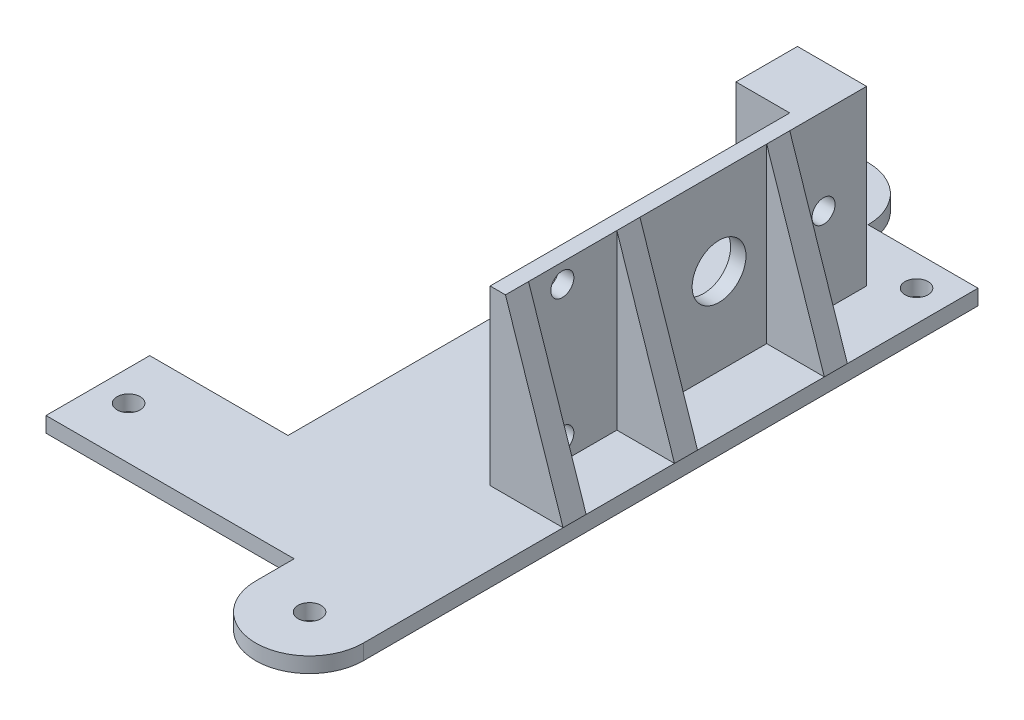
ISO-10303-21;
HEADER;
FILE_DESCRIPTION(('STEP AP214'),'2;1');
FILE_NAME('part.step','',(''),(''),'','','');
FILE_SCHEMA(('AUTOMOTIVE_DESIGN { 1 0 10303 214 1 1 1 1 }'));
ENDSEC;
DATA;
#1=APPLICATION_CONTEXT('core data for automotive mechanical design processes');
#2=APPLICATION_PROTOCOL_DEFINITION('international standard','automotive_design',2000,#1);
#3=PRODUCT_CONTEXT('',#1,'mechanical');
#4=PRODUCT('Part','Part','',(#3));
#5=PRODUCT_RELATED_PRODUCT_CATEGORY('part','',(#4));
#6=PRODUCT_DEFINITION_FORMATION('','',#4);
#7=PRODUCT_DEFINITION_CONTEXT('part definition',#1,'design');
#8=PRODUCT_DEFINITION('design','',#6,#7);
#9=PRODUCT_DEFINITION_SHAPE('','',#8);
#10=(LENGTH_UNIT() NAMED_UNIT(*) SI_UNIT(.MILLI.,.METRE.));
#11=(NAMED_UNIT(*) PLANE_ANGLE_UNIT() SI_UNIT($,.RADIAN.));
#12=(NAMED_UNIT(*) SI_UNIT($,.STERADIAN.) SOLID_ANGLE_UNIT());
#13=UNCERTAINTY_MEASURE_WITH_UNIT(LENGTH_MEASURE(1.E-05),#10,'distance_accuracy_value','');
#14=(GEOMETRIC_REPRESENTATION_CONTEXT(3) GLOBAL_UNCERTAINTY_ASSIGNED_CONTEXT((#13)) GLOBAL_UNIT_ASSIGNED_CONTEXT((#10,
#11,#12)) REPRESENTATION_CONTEXT('',''));
#15=CARTESIAN_POINT('',(0.,0.,0.));
#16=DIRECTION('',(0.,0.,1.));
#17=DIRECTION('',(1.,0.,0.));
#18=AXIS2_PLACEMENT_3D('',#15,#16,#17);
#19=CARTESIAN_POINT('',(-7.5,24.5,54.));
#20=DIRECTION('',(-1.,0.,0.));
#21=DIRECTION('',(0.,0.,1.));
#22=AXIS2_PLACEMENT_3D('',#19,#20,#21);
#23=PLANE('',#22);
#24=CARTESIAN_POINT('',(-7.5,13.25,12.6));
#25=DIRECTION('',(1.,0.,0.));
#26=DIRECTION('',(0.,0.,-1.));
#27=AXIS2_PLACEMENT_3D('',#24,#25,#26);
#28=CIRCLE('',#27,1.5);
#29=CARTESIAN_POINT('',(-7.5,13.25,11.1));
#30=VERTEX_POINT('',#29);
#31=EDGE_CURVE('E336',#30,#30,#28,.T.);
#32=ORIENTED_EDGE('',*,*,#31,.F.);
#33=EDGE_LOOP('',(#32));
#34=FACE_BOUND('',#33,.T.);
#35=DIRECTION('',(0.,1.,0.));
#36=VECTOR('',#35,1.);
#37=CARTESIAN_POINT('',(-7.5,24.5,17.));
#38=LINE('',#37,#36);
#39=CARTESIAN_POINT('',(-7.5,2.,17.));
#40=VERTEX_POINT('',#39);
#41=CARTESIAN_POINT('',(-7.5,24.5,17.));
#42=VERTEX_POINT('',#41);
#43=EDGE_CURVE('E215',#40,#42,#38,.T.);
#44=ORIENTED_EDGE('',*,*,#43,.F.);
#45=DIRECTION('',(0.,0.,-1.));
#46=VECTOR('',#45,1.);
#47=CARTESIAN_POINT('',(-7.5,2.,54.));
#48=LINE('',#47,#46);
#49=CARTESIAN_POINT('',(-7.5,2.,7.));
#50=VERTEX_POINT('',#49);
#51=EDGE_CURVE('E392',#40,#50,#48,.T.);
#52=ORIENTED_EDGE('',*,*,#51,.T.);
#53=DIRECTION('',(0.,-1.,0.));
#54=VECTOR('',#53,1.);
#55=CARTESIAN_POINT('',(-7.5,24.5,7.));
#56=LINE('',#55,#54);
#57=CARTESIAN_POINT('',(-7.5,24.5,7.));
#58=VERTEX_POINT('',#57);
#59=EDGE_CURVE('E378',#58,#50,#56,.T.);
#60=ORIENTED_EDGE('',*,*,#59,.F.);
#61=DIRECTION('',(0.,0.,-1.));
#62=VECTOR('',#61,1.);
#63=CARTESIAN_POINT('',(-7.5,24.5,54.));
#64=LINE('',#63,#62);
#65=EDGE_CURVE('E374',#42,#58,#64,.T.);
#66=ORIENTED_EDGE('',*,*,#65,.F.);
#67=EDGE_LOOP('',(#44,#52,#60,#66));
#68=FACE_BOUND('',#67,.T.);
#69=ADVANCED_FACE('F33',(#34,#68),#23,.F.);
#70=CARTESIAN_POINT('',(-7.,2.,80.));
#71=DIRECTION('',(0.,-1.,0.));
#72=DIRECTION('',(0.,0.,-1.));
#73=AXIS2_PLACEMENT_3D('',#70,#71,#72);
#74=PLANE('',#73);
#75=DIRECTION('',(0.,0.,-1.));
#76=VECTOR('',#75,1.);
#77=CARTESIAN_POINT('',(0.,2.,80.));
#78=LINE('',#77,#76);
#79=CARTESIAN_POINT('',(0.,2.,36.5));
#80=VERTEX_POINT('',#79);
#81=CARTESIAN_POINT('',(0.,2.,20.));
#82=VERTEX_POINT('',#81);
#83=EDGE_CURVE('E212',#80,#82,#78,.T.);
#84=ORIENTED_EDGE('',*,*,#83,.T.);
#85=DIRECTION('',(1.,0.,0.));
#86=VECTOR('',#85,1.);
#87=CARTESIAN_POINT('',(-23.15,2.,20.));
#88=LINE('',#87,#86);
#89=CARTESIAN_POINT('',(-7.5,2.,20.));
#90=VERTEX_POINT('',#89);
#91=EDGE_CURVE('E189',#90,#82,#88,.T.);
#92=ORIENTED_EDGE('',*,*,#91,.F.);
#93=CARTESIAN_POINT('',(-7.5,2.,36.5));
#94=VERTEX_POINT('',#93);
#95=EDGE_CURVE('E395',#94,#90,#48,.T.);
#96=ORIENTED_EDGE('',*,*,#95,.F.);
#97=DIRECTION('',(1.,0.,0.));
#98=VECTOR('',#97,1.);
#99=CARTESIAN_POINT('',(-23.15,2.,36.5));
#100=LINE('',#99,#98);
#101=EDGE_CURVE('E219',#94,#80,#100,.T.);
#102=ORIENTED_EDGE('',*,*,#101,.T.);
#103=EDGE_LOOP('',(#84,#92,#96,#102));
#104=FACE_BOUND('',#103,.T.);
#105=ADVANCED_FACE('F218',(#104),#74,.F.);
#106=CARTESIAN_POINT('',(-7.5,13.25,26.2));
#107=DIRECTION('',(1.,0.,0.));
#108=DIRECTION('',(0.,0.,-1.));
#109=AXIS2_PLACEMENT_3D('',#106,#107,#108);
#110=CIRCLE('',#109,3.5);
#111=CARTESIAN_POINT('',(-7.5,13.25,22.7));
#112=VERTEX_POINT('',#111);
#113=EDGE_CURVE('E344',#112,#112,#110,.T.);
#114=ORIENTED_EDGE('',*,*,#113,.F.);
#115=EDGE_LOOP('',(#114));
#116=FACE_BOUND('',#115,.T.);
#117=ORIENTED_EDGE('',*,*,#95,.T.);
#118=DIRECTION('',(0.,1.,0.));
#119=VECTOR('',#118,1.);
#120=CARTESIAN_POINT('',(-7.5,24.5,20.));
#121=LINE('',#120,#119);
#122=CARTESIAN_POINT('',(-7.5,24.5,20.));
#123=VERTEX_POINT('',#122);
#124=EDGE_CURVE('E194',#90,#123,#121,.T.);
#125=ORIENTED_EDGE('',*,*,#124,.T.);
#126=CARTESIAN_POINT('',(-7.5,24.5,36.5));
#127=VERTEX_POINT('',#126);
#128=EDGE_CURVE('E475',#127,#123,#64,.T.);
#129=ORIENTED_EDGE('',*,*,#128,.F.);
#130=DIRECTION('',(0.,1.,0.));
#131=VECTOR('',#130,1.);
#132=CARTESIAN_POINT('',(-7.5,24.5,36.5));
#133=LINE('',#132,#131);
#134=EDGE_CURVE('E318',#94,#127,#133,.T.);
#135=ORIENTED_EDGE('',*,*,#134,.F.);
#136=EDGE_LOOP('',(#117,#125,#129,#135));
#137=FACE_BOUND('',#136,.T.);
#138=ADVANCED_FACE('F473',(#116,#137),#23,.F.);
#139=CARTESIAN_POINT('',(0.,2.,51.));
#140=VERTEX_POINT('',#139);
#141=CARTESIAN_POINT('',(0.,2.,39.5));
#142=VERTEX_POINT('',#141);
#143=EDGE_CURVE('E220',#140,#142,#78,.T.);
#144=ORIENTED_EDGE('',*,*,#143,.T.);
#145=DIRECTION('',(1.,0.,0.));
#146=VECTOR('',#145,1.);
#147=CARTESIAN_POINT('',(-23.15,2.,39.5));
#148=LINE('',#147,#146);
#149=CARTESIAN_POINT('',(-7.5,2.,39.5));
#150=VERTEX_POINT('',#149);
#151=EDGE_CURVE('E312',#150,#142,#148,.T.);
#152=ORIENTED_EDGE('',*,*,#151,.F.);
#153=CARTESIAN_POINT('',(-7.5,2.,51.));
#154=VERTEX_POINT('',#153);
#155=EDGE_CURVE('E365',#154,#150,#48,.T.);
#156=ORIENTED_EDGE('',*,*,#155,.F.);
#157=DIRECTION('',(1.,0.,0.));
#158=VECTOR('',#157,1.);
#159=CARTESIAN_POINT('',(-23.15,2.,51.));
#160=LINE('',#159,#158);
#161=EDGE_CURVE('E327',#154,#140,#160,.T.);
#162=ORIENTED_EDGE('',*,*,#161,.T.);
#163=EDGE_LOOP('',(#144,#152,#156,#162));
#164=FACE_BOUND('',#163,.T.);
#165=ADVANCED_FACE('F437',(#164),#74,.F.);
#166=CARTESIAN_POINT('',(-7.5,4.5,46.6));
#167=DIRECTION('',(1.,0.,0.));
#168=DIRECTION('',(0.,0.,-1.));
#169=AXIS2_PLACEMENT_3D('',#166,#167,#168);
#170=CIRCLE('',#169,1.5);
#171=CARTESIAN_POINT('',(-7.5,4.5,45.1));
#172=VERTEX_POINT('',#171);
#173=EDGE_CURVE('E341',#172,#172,#170,.T.);
#174=ORIENTED_EDGE('',*,*,#173,.F.);
#175=EDGE_LOOP('',(#174));
#176=FACE_BOUND('',#175,.T.);
#177=CARTESIAN_POINT('',(-7.5,22.,46.6));
#178=DIRECTION('',(1.,0.,0.));
#179=DIRECTION('',(0.,0.,-1.));
#180=AXIS2_PLACEMENT_3D('',#177,#178,#179);
#181=CIRCLE('',#180,1.5);
#182=CARTESIAN_POINT('',(-7.5,22.,45.1));
#183=VERTEX_POINT('',#182);
#184=EDGE_CURVE('E337',#183,#183,#181,.T.);
#185=ORIENTED_EDGE('',*,*,#184,.F.);
#186=EDGE_LOOP('',(#185));
#187=FACE_BOUND('',#186,.T.);
#188=ORIENTED_EDGE('',*,*,#155,.T.);
#189=DIRECTION('',(0.,1.,0.));
#190=VECTOR('',#189,1.);
#191=CARTESIAN_POINT('',(-7.5,24.5,39.5));
#192=LINE('',#191,#190);
#193=CARTESIAN_POINT('',(-7.5,24.5,39.5));
#194=VERTEX_POINT('',#193);
#195=EDGE_CURVE('E320',#150,#194,#192,.T.);
#196=ORIENTED_EDGE('',*,*,#195,.T.);
#197=CARTESIAN_POINT('',(-7.5,24.5,51.));
#198=VERTEX_POINT('',#197);
#199=EDGE_CURVE('E379',#198,#194,#64,.T.);
#200=ORIENTED_EDGE('',*,*,#199,.F.);
#201=DIRECTION('',(0.,1.,0.));
#202=VECTOR('',#201,1.);
#203=CARTESIAN_POINT('',(-7.5,24.5,51.));
#204=LINE('',#203,#202);
#205=EDGE_CURVE('E333',#154,#198,#204,.T.);
#206=ORIENTED_EDGE('',*,*,#205,.F.);
#207=EDGE_LOOP('',(#188,#196,#200,#206));
#208=FACE_BOUND('',#207,.T.);
#209=ADVANCED_FACE('F440',(#176,#187,#208),#23,.F.);
#210=CARTESIAN_POINT('',(-4.,2.,4.));
#211=DIRECTION('',(0.,1.,0.));
#212=DIRECTION('',(0.,0.,1.));
#213=AXIS2_PLACEMENT_3D('',#210,#211,#212);
#214=CIRCLE('',#213,1.5);
#215=CARTESIAN_POINT('',(-4.,2.,5.5));
#216=VERTEX_POINT('',#215);
#217=EDGE_CURVE('E293',#216,#216,#214,.T.);
#218=ORIENTED_EDGE('',*,*,#217,.F.);
#219=EDGE_LOOP('',(#218));
#220=FACE_BOUND('',#219,.T.);
#221=CARTESIAN_POINT('',(-42.3,2.,68.25));
#222=DIRECTION('',(0.,1.,0.));
#223=DIRECTION('',(0.,0.,1.));
#224=AXIS2_PLACEMENT_3D('',#221,#222,#223);
#225=CIRCLE('',#224,1.5);
#226=CARTESIAN_POINT('',(-42.3,2.,69.75));
#227=VERTEX_POINT('',#226);
#228=EDGE_CURVE('E282',#227,#227,#225,.T.);
#229=ORIENTED_EDGE('',*,*,#228,.F.);
#230=EDGE_LOOP('',(#229));
#231=FACE_BOUND('',#230,.T.);
#232=CARTESIAN_POINT('',(-7.,2.,80.));
#233=DIRECTION('',(0.,1.,0.));
#234=DIRECTION('',(0.,0.,1.));
#235=AXIS2_PLACEMENT_3D('',#232,#233,#234);
#236=CIRCLE('',#235,1.5);
#237=CARTESIAN_POINT('',(-7.,2.,81.5));
#238=VERTEX_POINT('',#237);
#239=EDGE_CURVE('E281',#238,#238,#236,.T.);
#240=ORIENTED_EDGE('',*,*,#239,.F.);
#241=EDGE_LOOP('',(#240));
#242=FACE_BOUND('',#241,.T.);
#243=CARTESIAN_POINT('',(-21.3,2.,0.));
#244=DIRECTION('',(0.,1.,0.));
#245=DIRECTION('',(0.,0.,1.));
#246=AXIS2_PLACEMENT_3D('',#243,#244,#245);
#247=CIRCLE('',#246,1.5);
#248=CARTESIAN_POINT('',(-21.3,2.,1.49999999999995));
#249=VERTEX_POINT('',#248);
#250=EDGE_CURVE('E297',#249,#249,#247,.T.);
#251=ORIENTED_EDGE('',*,*,#250,.F.);
#252=EDGE_LOOP('',(#251));
#253=FACE_BOUND('',#252,.T.);
#254=DIRECTION('',(1.,0.,0.));
#255=VECTOR('',#254,1.);
#256=CARTESIAN_POINT('',(-9.49999999999999,2.,54.));
#257=LINE('',#256,#255);
#258=CARTESIAN_POINT('',(-9.49999999999999,2.,54.));
#259=VERTEX_POINT('',#258);
#260=CARTESIAN_POINT('',(0.,2.,54.));
#261=VERTEX_POINT('',#260);
#262=EDGE_CURVE('E390',#259,#261,#257,.T.);
#263=ORIENTED_EDGE('',*,*,#262,.F.);
#264=DIRECTION('',(0.,0.,1.));
#265=VECTOR('',#264,1.);
#266=CARTESIAN_POINT('',(-9.5,2.,15.));
#267=LINE('',#266,#265);
#268=CARTESIAN_POINT('',(-9.5,2.,15.));
#269=VERTEX_POINT('',#268);
#270=EDGE_CURVE('E388',#269,#259,#267,.T.);
#271=ORIENTED_EDGE('',*,*,#270,.F.);
#272=DIRECTION('',(1.,0.,0.));
#273=VECTOR('',#272,1.);
#274=CARTESIAN_POINT('',(-16.5,2.,15.));
#275=LINE('',#274,#273);
#276=CARTESIAN_POINT('',(-16.5,2.,15.));
#277=VERTEX_POINT('',#276);
#278=EDGE_CURVE('E385',#277,#269,#275,.T.);
#279=ORIENTED_EDGE('',*,*,#278,.F.);
#280=DIRECTION('',(0.,0.,1.));
#281=VECTOR('',#280,1.);
#282=CARTESIAN_POINT('',(-16.5,2.,7.));
#283=LINE('',#282,#281);
#284=CARTESIAN_POINT('',(-16.5,2.,7.00000000000001));
#285=VERTEX_POINT('',#284);
#286=EDGE_CURVE('E382',#285,#277,#283,.T.);
#287=ORIENTED_EDGE('',*,*,#286,.F.);
#288=DIRECTION('',(-1.,0.,0.));
#289=VECTOR('',#288,1.);
#290=CARTESIAN_POINT('',(-7.5,2.,7.));
#291=LINE('',#290,#289);
#292=EDGE_CURVE('E360',#50,#285,#291,.T.);
#293=ORIENTED_EDGE('',*,*,#292,.F.);
#294=ORIENTED_EDGE('',*,*,#51,.F.);
#295=DIRECTION('',(1.,0.,0.));
#296=VECTOR('',#295,1.);
#297=CARTESIAN_POINT('',(-7.5,2.,17.));
#298=LINE('',#297,#296);
#299=CARTESIAN_POINT('',(0.,2.,17.));
#300=VERTEX_POINT('',#299);
#301=EDGE_CURVE('E205',#40,#300,#298,.T.);
#302=ORIENTED_EDGE('',*,*,#301,.T.);
#303=CARTESIAN_POINT('',(0.,2.,0.));
#304=VERTEX_POINT('',#303);
#305=EDGE_CURVE('E214',#300,#304,#78,.T.);
#306=ORIENTED_EDGE('',*,*,#305,.T.);
#307=DIRECTION('',(-1.,0.,0.));
#308=VECTOR('',#307,1.);
#309=CARTESIAN_POINT('',(0.,2.,0.));
#310=LINE('',#309,#308);
#311=CARTESIAN_POINT('',(-14.3,2.,0.));
#312=VERTEX_POINT('',#311);
#313=EDGE_CURVE('E228',#304,#312,#310,.T.);
#314=ORIENTED_EDGE('',*,*,#313,.T.);
#315=CARTESIAN_POINT('',(-21.3,2.,0.));
#316=DIRECTION('',(0.,1.,0.));
#317=DIRECTION('',(0.,0.,-1.));
#318=AXIS2_PLACEMENT_3D('',#315,#316,#317);
#319=CIRCLE('',#318,7.);
#320=CARTESIAN_POINT('',(-28.3,2.,0.));
#321=VERTEX_POINT('',#320);
#322=EDGE_CURVE('E231',#312,#321,#319,.T.);
#323=ORIENTED_EDGE('',*,*,#322,.T.);
#324=DIRECTION('',(0.,0.,1.));
#325=VECTOR('',#324,1.);
#326=CARTESIAN_POINT('',(-28.3,2.,61.5));
#327=LINE('',#326,#325);
#328=CARTESIAN_POINT('',(-28.3,2.,61.5));
#329=VERTEX_POINT('',#328);
#330=EDGE_CURVE('E233',#321,#329,#327,.T.);
#331=ORIENTED_EDGE('',*,*,#330,.T.);
#332=DIRECTION('',(-1.,0.,0.));
#333=VECTOR('',#332,1.);
#334=CARTESIAN_POINT('',(-28.3,2.,61.5));
#335=LINE('',#334,#333);
#336=CARTESIAN_POINT('',(-46.3,2.,61.5));
#337=VERTEX_POINT('',#336);
#338=EDGE_CURVE('E257',#329,#337,#335,.T.);
#339=ORIENTED_EDGE('',*,*,#338,.T.);
#340=DIRECTION('',(0.,0.,1.));
#341=VECTOR('',#340,1.);
#342=CARTESIAN_POINT('',(-46.3,2.,61.5));
#343=LINE('',#342,#341);
#344=CARTESIAN_POINT('',(-46.3,2.,75.));
#345=VERTEX_POINT('',#344);
#346=EDGE_CURVE('E411',#337,#345,#343,.T.);
#347=ORIENTED_EDGE('',*,*,#346,.T.);
#348=DIRECTION('',(1.,0.,0.));
#349=VECTOR('',#348,1.);
#350=CARTESIAN_POINT('',(-46.3,2.,75.));
#351=LINE('',#350,#349);
#352=CARTESIAN_POINT('',(-14.,2.,75.));
#353=VERTEX_POINT('',#352);
#354=EDGE_CURVE('E413',#345,#353,#351,.T.);
#355=ORIENTED_EDGE('',*,*,#354,.T.);
#356=DIRECTION('',(0.,0.,1.));
#357=VECTOR('',#356,1.);
#358=CARTESIAN_POINT('',(-14.,2.,80.));
#359=LINE('',#358,#357);
#360=CARTESIAN_POINT('',(-14.,2.,80.));
#361=VERTEX_POINT('',#360);
#362=EDGE_CURVE('E414',#353,#361,#359,.T.);
#363=ORIENTED_EDGE('',*,*,#362,.T.);
#364=CARTESIAN_POINT('',(-7.,2.,80.));
#365=DIRECTION('',(0.,1.,0.));
#366=DIRECTION('',(0.,0.,-1.));
#367=AXIS2_PLACEMENT_3D('',#364,#365,#366);
#368=CIRCLE('',#367,7.);
#369=CARTESIAN_POINT('',(0.,2.,80.));
#370=VERTEX_POINT('',#369);
#371=EDGE_CURVE('E224',#361,#370,#368,.T.);
#372=ORIENTED_EDGE('',*,*,#371,.T.);
#373=EDGE_CURVE('E223',#370,#261,#78,.T.);
#374=ORIENTED_EDGE('',*,*,#373,.T.);
#375=EDGE_LOOP('',(#263,#271,#279,#287,#293,#294,#302,#306,#314,#323,#331,#339,#347,#355,#363,
#372,#374));
#376=FACE_BOUND('',#375,.T.);
#377=ADVANCED_FACE('F421',(#220,#231,#242,#253,#376),#74,.F.);
#378=CARTESIAN_POINT('',(-28.3,2.,61.5));
#379=DIRECTION('',(0.,0.,1.));
#380=DIRECTION('',(1.,0.,0.));
#381=AXIS2_PLACEMENT_3D('',#378,#379,#380);
#382=PLANE('',#381);
#383=DIRECTION('',(-1.,0.,0.));
#384=VECTOR('',#383,1.);
#385=CARTESIAN_POINT('',(-28.3,0.,61.5));
#386=LINE('',#385,#384);
#387=CARTESIAN_POINT('',(-28.3,0.,61.5));
#388=VERTEX_POINT('',#387);
#389=CARTESIAN_POINT('',(-46.3,0.,61.5));
#390=VERTEX_POINT('',#389);
#391=EDGE_CURVE('E236',#388,#390,#386,.T.);
#392=ORIENTED_EDGE('',*,*,#391,.T.);
#393=DIRECTION('',(0.,-1.,0.));
#394=VECTOR('',#393,1.);
#395=CARTESIAN_POINT('',(-46.3,2.,61.5));
#396=LINE('',#395,#394);
#397=EDGE_CURVE('E11',#337,#390,#396,.T.);
#398=ORIENTED_EDGE('',*,*,#397,.F.);
#399=ORIENTED_EDGE('',*,*,#338,.F.);
#400=DIRECTION('',(0.,-1.,0.));
#401=VECTOR('',#400,1.);
#402=CARTESIAN_POINT('',(-28.3,2.,61.5));
#403=LINE('',#402,#401);
#404=EDGE_CURVE('E235',#329,#388,#403,.T.);
#405=ORIENTED_EDGE('',*,*,#404,.T.);
#406=EDGE_LOOP('',(#392,#398,#399,#405));
#407=FACE_BOUND('',#406,.T.);
#408=ADVANCED_FACE('F35',(#407),#382,.F.);
#409=CARTESIAN_POINT('',(-46.3,2.,61.5));
#410=DIRECTION('',(1.,0.,0.));
#411=DIRECTION('',(0.,0.,-1.));
#412=AXIS2_PLACEMENT_3D('',#409,#410,#411);
#413=PLANE('',#412);
#414=DIRECTION('',(0.,0.,1.));
#415=VECTOR('',#414,1.);
#416=CARTESIAN_POINT('',(-46.3,0.,61.5));
#417=LINE('',#416,#415);
#418=CARTESIAN_POINT('',(-46.3,0.,75.));
#419=VERTEX_POINT('',#418);
#420=EDGE_CURVE('E239',#390,#419,#417,.T.);
#421=ORIENTED_EDGE('',*,*,#420,.T.);
#422=DIRECTION('',(0.,-1.,0.));
#423=VECTOR('',#422,1.);
#424=CARTESIAN_POINT('',(-46.3,2.,75.));
#425=LINE('',#424,#423);
#426=EDGE_CURVE('E42',#345,#419,#425,.T.);
#427=ORIENTED_EDGE('',*,*,#426,.F.);
#428=ORIENTED_EDGE('',*,*,#346,.F.);
#429=ORIENTED_EDGE('',*,*,#397,.T.);
#430=EDGE_LOOP('',(#421,#427,#428,#429));
#431=FACE_BOUND('',#430,.T.);
#432=ADVANCED_FACE('F578',(#431),#413,.F.);
#433=CARTESIAN_POINT('',(-46.3,2.,75.));
#434=DIRECTION('',(0.,0.,-1.));
#435=DIRECTION('',(-1.,0.,0.));
#436=AXIS2_PLACEMENT_3D('',#433,#434,#435);
#437=PLANE('',#436);
#438=DIRECTION('',(1.,0.,0.));
#439=VECTOR('',#438,1.);
#440=CARTESIAN_POINT('',(-46.3,0.,75.));
#441=LINE('',#440,#439);
#442=CARTESIAN_POINT('',(-14.,0.,75.));
#443=VERTEX_POINT('',#442);
#444=EDGE_CURVE('E242',#419,#443,#441,.T.);
#445=ORIENTED_EDGE('',*,*,#444,.T.);
#446=DIRECTION('',(0.,-1.,0.));
#447=VECTOR('',#446,1.);
#448=CARTESIAN_POINT('',(-14.,2.,75.));
#449=LINE('',#448,#447);
#450=EDGE_CURVE('E275',#353,#443,#449,.T.);
#451=ORIENTED_EDGE('',*,*,#450,.F.);
#452=ORIENTED_EDGE('',*,*,#354,.F.);
#453=ORIENTED_EDGE('',*,*,#426,.T.);
#454=EDGE_LOOP('',(#445,#451,#452,#453));
#455=FACE_BOUND('',#454,.T.);
#456=ADVANCED_FACE('F575',(#455),#437,.F.);
#457=CARTESIAN_POINT('',(-14.,2.,80.));
#458=DIRECTION('',(1.,0.,0.));
#459=DIRECTION('',(0.,0.,-1.));
#460=AXIS2_PLACEMENT_3D('',#457,#458,#459);
#461=PLANE('',#460);
#462=DIRECTION('',(0.,0.,1.));
#463=VECTOR('',#462,1.);
#464=CARTESIAN_POINT('',(-14.,0.,80.));
#465=LINE('',#464,#463);
#466=CARTESIAN_POINT('',(-14.,0.,80.));
#467=VERTEX_POINT('',#466);
#468=EDGE_CURVE('E244',#443,#467,#465,.T.);
#469=ORIENTED_EDGE('',*,*,#468,.T.);
#470=DIRECTION('',(0.,-1.,0.));
#471=VECTOR('',#470,1.);
#472=CARTESIAN_POINT('',(-14.,2.,80.));
#473=LINE('',#472,#471);
#474=EDGE_CURVE('E272',#361,#467,#473,.T.);
#475=ORIENTED_EDGE('',*,*,#474,.F.);
#476=ORIENTED_EDGE('',*,*,#362,.F.);
#477=ORIENTED_EDGE('',*,*,#450,.T.);
#478=EDGE_LOOP('',(#469,#475,#476,#477));
#479=FACE_BOUND('',#478,.T.);
#480=ADVANCED_FACE('F572',(#479),#461,.F.);
#481=CARTESIAN_POINT('',(-7.,2.,80.));
#482=DIRECTION('',(0.,-1.,0.));
#483=DIRECTION('',(0.,0.,-1.));
#484=AXIS2_PLACEMENT_3D('',#481,#482,#483);
#485=CYLINDRICAL_SURFACE('',#484,7.);
#486=CARTESIAN_POINT('',(-7.,0.,80.));
#487=DIRECTION('',(0.,1.,0.));
#488=DIRECTION('',(0.,0.,1.));
#489=AXIS2_PLACEMENT_3D('',#486,#487,#488);
#490=CIRCLE('',#489,7.);
#491=CARTESIAN_POINT('',(0.,0.,80.));
#492=VERTEX_POINT('',#491);
#493=EDGE_CURVE('E247',#467,#492,#490,.T.);
#494=ORIENTED_EDGE('',*,*,#493,.T.);
#495=DIRECTION('',(0.,-1.,0.));
#496=VECTOR('',#495,1.);
#497=CARTESIAN_POINT('',(0.,2.,80.));
#498=LINE('',#497,#496);
#499=EDGE_CURVE('E269',#370,#492,#498,.T.);
#500=ORIENTED_EDGE('',*,*,#499,.F.);
#501=ORIENTED_EDGE('',*,*,#371,.F.);
#502=ORIENTED_EDGE('',*,*,#474,.T.);
#503=EDGE_LOOP('',(#494,#500,#501,#502));
#504=FACE_BOUND('',#503,.T.);
#505=ADVANCED_FACE('F424',(#504),#485,.T.);
#506=CARTESIAN_POINT('',(0.,2.,80.));
#507=DIRECTION('',(-1.,0.,0.));
#508=DIRECTION('',(0.,0.,1.));
#509=AXIS2_PLACEMENT_3D('',#506,#507,#508);
#510=PLANE('',#509);
#511=DIRECTION('',(0.,0.,-1.));
#512=VECTOR('',#511,1.);
#513=CARTESIAN_POINT('',(0.,0.,80.));
#514=LINE('',#513,#512);
#515=CARTESIAN_POINT('',(0.,0.,0.));
#516=VERTEX_POINT('',#515);
#517=EDGE_CURVE('E249',#492,#516,#514,.T.);
#518=ORIENTED_EDGE('',*,*,#517,.T.);
#519=DIRECTION('',(0.,-1.,0.));
#520=VECTOR('',#519,1.);
#521=CARTESIAN_POINT('',(0.,2.,0.));
#522=LINE('',#521,#520);
#523=EDGE_CURVE('E266',#304,#516,#522,.T.);
#524=ORIENTED_EDGE('',*,*,#523,.F.);
#525=ORIENTED_EDGE('',*,*,#305,.F.);
#526=DIRECTION('',(0.,0.,1.));
#527=VECTOR('',#526,1.);
#528=CARTESIAN_POINT('',(0.,2.,17.));
#529=LINE('',#528,#527);
#530=EDGE_CURVE('E199',#300,#82,#529,.T.);
#531=ORIENTED_EDGE('',*,*,#530,.T.);
#532=ORIENTED_EDGE('',*,*,#83,.F.);
#533=DIRECTION('',(0.,0.,1.));
#534=VECTOR('',#533,1.);
#535=CARTESIAN_POINT('',(0.,2.,38.));
#536=LINE('',#535,#534);
#537=EDGE_CURVE('E314',#80,#142,#536,.T.);
#538=ORIENTED_EDGE('',*,*,#537,.T.);
#539=ORIENTED_EDGE('',*,*,#143,.F.);
#540=DIRECTION('',(0.,0.,1.));
#541=VECTOR('',#540,1.);
#542=CARTESIAN_POINT('',(0.,2.,54.));
#543=LINE('',#542,#541);
#544=EDGE_CURVE('E326',#140,#261,#543,.T.);
#545=ORIENTED_EDGE('',*,*,#544,.T.);
#546=ORIENTED_EDGE('',*,*,#373,.F.);
#547=ORIENTED_EDGE('',*,*,#499,.T.);
#548=EDGE_LOOP('',(#518,#524,#525,#531,#532,#538,#539,#545,#546,#547));
#549=FACE_BOUND('',#548,.T.);
#550=ADVANCED_FACE('F210',(#549),#510,.F.);
#551=CARTESIAN_POINT('',(0.,2.,0.));
#552=DIRECTION('',(0.,0.,1.));
#553=DIRECTION('',(1.,0.,0.));
#554=AXIS2_PLACEMENT_3D('',#551,#552,#553);
#555=PLANE('',#554);
#556=DIRECTION('',(-1.,0.,0.));
#557=VECTOR('',#556,1.);
#558=CARTESIAN_POINT('',(0.,0.,0.));
#559=LINE('',#558,#557);
#560=CARTESIAN_POINT('',(-14.3,0.,0.));
#561=VERTEX_POINT('',#560);
#562=EDGE_CURVE('E251',#516,#561,#559,.T.);
#563=ORIENTED_EDGE('',*,*,#562,.T.);
#564=DIRECTION('',(0.,-1.,0.));
#565=VECTOR('',#564,1.);
#566=CARTESIAN_POINT('',(-14.3,2.,0.));
#567=LINE('',#566,#565);
#568=EDGE_CURVE('E263',#312,#561,#567,.T.);
#569=ORIENTED_EDGE('',*,*,#568,.F.);
#570=ORIENTED_EDGE('',*,*,#313,.F.);
#571=ORIENTED_EDGE('',*,*,#523,.T.);
#572=EDGE_LOOP('',(#563,#569,#570,#571));
#573=FACE_BOUND('',#572,.T.);
#574=ADVANCED_FACE('F563',(#573),#555,.F.);
#575=CARTESIAN_POINT('',(-21.3,2.,0.));
#576=DIRECTION('',(0.,-1.,0.));
#577=DIRECTION('',(0.,0.,-1.));
#578=AXIS2_PLACEMENT_3D('',#575,#576,#577);
#579=CYLINDRICAL_SURFACE('',#578,7.);
#580=CARTESIAN_POINT('',(-21.3,0.,0.));
#581=DIRECTION('',(0.,1.,0.));
#582=DIRECTION('',(0.,0.,-1.));
#583=AXIS2_PLACEMENT_3D('',#580,#581,#582);
#584=CIRCLE('',#583,7.);
#585=CARTESIAN_POINT('',(-28.3,0.,0.));
#586=VERTEX_POINT('',#585);
#587=EDGE_CURVE('E253',#561,#586,#584,.T.);
#588=ORIENTED_EDGE('',*,*,#587,.T.);
#589=DIRECTION('',(0.,-1.,0.));
#590=VECTOR('',#589,1.);
#591=CARTESIAN_POINT('',(-28.3,2.,0.));
#592=LINE('',#591,#590);
#593=EDGE_CURVE('E260',#321,#586,#592,.T.);
#594=ORIENTED_EDGE('',*,*,#593,.F.);
#595=ORIENTED_EDGE('',*,*,#322,.F.);
#596=ORIENTED_EDGE('',*,*,#568,.T.);
#597=EDGE_LOOP('',(#588,#594,#595,#596));
#598=FACE_BOUND('',#597,.T.);
#599=ADVANCED_FACE('F559',(#598),#579,.T.);
#600=CARTESIAN_POINT('',(-28.3,2.,61.5));
#601=DIRECTION('',(1.,0.,0.));
#602=DIRECTION('',(0.,0.,-1.));
#603=AXIS2_PLACEMENT_3D('',#600,#601,#602);
#604=PLANE('',#603);
#605=DIRECTION('',(0.,0.,1.));
#606=VECTOR('',#605,1.);
#607=CARTESIAN_POINT('',(-28.3,0.,61.5));
#608=LINE('',#607,#606);
#609=EDGE_CURVE('E255',#586,#388,#608,.T.);
#610=ORIENTED_EDGE('',*,*,#609,.T.);
#611=ORIENTED_EDGE('',*,*,#404,.F.);
#612=ORIENTED_EDGE('',*,*,#330,.F.);
#613=ORIENTED_EDGE('',*,*,#593,.T.);
#614=EDGE_LOOP('',(#610,#611,#612,#613));
#615=FACE_BOUND('',#614,.T.);
#616=ADVANCED_FACE('F555',(#615),#604,.F.);
#617=CARTESIAN_POINT('',(-7.,0.,80.));
#618=DIRECTION('',(0.,-1.,0.));
#619=DIRECTION('',(0.,0.,-1.));
#620=AXIS2_PLACEMENT_3D('',#617,#618,#619);
#621=PLANE('',#620);
#622=CARTESIAN_POINT('',(-4.,0.,4.));
#623=DIRECTION('',(0.,-1.,0.));
#624=DIRECTION('',(0.,0.,-1.));
#625=AXIS2_PLACEMENT_3D('',#622,#623,#624);
#626=CIRCLE('',#625,1.5);
#627=CARTESIAN_POINT('',(-4.,0.,2.5));
#628=VERTEX_POINT('',#627);
#629=EDGE_CURVE('E37',#628,#628,#626,.T.);
#630=ORIENTED_EDGE('',*,*,#629,.F.);
#631=EDGE_LOOP('',(#630));
#632=FACE_BOUND('',#631,.T.);
#633=CARTESIAN_POINT('',(-42.3,0.,68.25));
#634=DIRECTION('',(0.,-1.,0.));
#635=DIRECTION('',(0.,0.,-1.));
#636=AXIS2_PLACEMENT_3D('',#633,#634,#635);
#637=CIRCLE('',#636,1.5);
#638=CARTESIAN_POINT('',(-42.3,0.,66.75));
#639=VERTEX_POINT('',#638);
#640=EDGE_CURVE('E279',#639,#639,#637,.T.);
#641=ORIENTED_EDGE('',*,*,#640,.F.);
#642=EDGE_LOOP('',(#641));
#643=FACE_BOUND('',#642,.T.);
#644=CARTESIAN_POINT('',(-7.,0.,80.));
#645=DIRECTION('',(0.,1.,0.));
#646=DIRECTION('',(0.,0.,1.));
#647=AXIS2_PLACEMENT_3D('',#644,#645,#646);
#648=CIRCLE('',#647,1.5);
#649=CARTESIAN_POINT('',(-7.,0.,81.5));
#650=VERTEX_POINT('',#649);
#651=EDGE_CURVE('E286',#650,#650,#648,.T.);
#652=ORIENTED_EDGE('',*,*,#651,.T.);
#653=EDGE_LOOP('',(#652));
#654=FACE_BOUND('',#653,.T.);
#655=CARTESIAN_POINT('',(-21.3,0.,0.));
#656=DIRECTION('',(0.,1.,0.));
#657=DIRECTION('',(0.,0.,1.));
#658=AXIS2_PLACEMENT_3D('',#655,#656,#657);
#659=CIRCLE('',#658,1.5);
#660=CARTESIAN_POINT('',(-21.3,0.,1.49999999999995));
#661=VERTEX_POINT('',#660);
#662=EDGE_CURVE('E299',#661,#661,#659,.T.);
#663=ORIENTED_EDGE('',*,*,#662,.T.);
#664=EDGE_LOOP('',(#663));
#665=FACE_BOUND('',#664,.T.);
#666=ORIENTED_EDGE('',*,*,#391,.F.);
#667=ORIENTED_EDGE('',*,*,#609,.F.);
#668=ORIENTED_EDGE('',*,*,#587,.F.);
#669=ORIENTED_EDGE('',*,*,#562,.F.);
#670=ORIENTED_EDGE('',*,*,#517,.F.);
#671=ORIENTED_EDGE('',*,*,#493,.F.);
#672=ORIENTED_EDGE('',*,*,#468,.F.);
#673=ORIENTED_EDGE('',*,*,#444,.F.);
#674=ORIENTED_EDGE('',*,*,#420,.F.);
#675=EDGE_LOOP('',(#666,#667,#668,#669,#670,#671,#672,#673,#674));
#676=FACE_BOUND('',#675,.T.);
#677=ADVANCED_FACE('F551',(#632,#643,#654,#665,#676),#621,.T.);
#678=CARTESIAN_POINT('',(-7.5,24.5,7.));
#679=DIRECTION('',(0.,0.,1.));
#680=DIRECTION('',(1.,0.,0.));
#681=AXIS2_PLACEMENT_3D('',#678,#679,#680);
#682=PLANE('',#681);
#683=ORIENTED_EDGE('',*,*,#292,.T.);
#684=DIRECTION('',(0.,-1.,0.));
#685=VECTOR('',#684,1.);
#686=CARTESIAN_POINT('',(-16.5,24.5,7.));
#687=LINE('',#686,#685);
#688=CARTESIAN_POINT('',(-16.5,24.5,7.));
#689=VERTEX_POINT('',#688);
#690=EDGE_CURVE('E240',#689,#285,#687,.T.);
#691=ORIENTED_EDGE('',*,*,#690,.F.);
#692=DIRECTION('',(-1.,0.,0.));
#693=VECTOR('',#692,1.);
#694=CARTESIAN_POINT('',(-7.5,24.5,7.));
#695=LINE('',#694,#693);
#696=EDGE_CURVE('E361',#58,#689,#695,.T.);
#697=ORIENTED_EDGE('',*,*,#696,.F.);
#698=ORIENTED_EDGE('',*,*,#59,.T.);
#699=EDGE_LOOP('',(#683,#691,#697,#698));
#700=FACE_BOUND('',#699,.T.);
#701=ADVANCED_FACE('F467',(#700),#682,.F.);
#702=CARTESIAN_POINT('',(-16.5,24.5,7.));
#703=DIRECTION('',(1.,0.,0.));
#704=DIRECTION('',(0.,0.,-1.));
#705=AXIS2_PLACEMENT_3D('',#702,#703,#704);
#706=PLANE('',#705);
#707=CARTESIAN_POINT('',(-16.5,13.25,12.6));
#708=DIRECTION('',(1.,0.,0.));
#709=DIRECTION('',(0.,0.,-1.));
#710=AXIS2_PLACEMENT_3D('',#707,#708,#709);
#711=CIRCLE('',#710,1.5);
#712=CARTESIAN_POINT('',(-16.5,13.25,11.1));
#713=VERTEX_POINT('',#712);
#714=EDGE_CURVE('E340',#713,#713,#711,.T.);
#715=ORIENTED_EDGE('',*,*,#714,.T.);
#716=EDGE_LOOP('',(#715));
#717=FACE_BOUND('',#716,.T.);
#718=ORIENTED_EDGE('',*,*,#286,.T.);
#719=DIRECTION('',(0.,-1.,0.));
#720=VECTOR('',#719,1.);
#721=CARTESIAN_POINT('',(-16.5,24.5,15.));
#722=LINE('',#721,#720);
#723=CARTESIAN_POINT('',(-16.5,24.5,15.));
#724=VERTEX_POINT('',#723);
#725=EDGE_CURVE('E404',#724,#277,#722,.T.);
#726=ORIENTED_EDGE('',*,*,#725,.F.);
#727=DIRECTION('',(0.,0.,1.));
#728=VECTOR('',#727,1.);
#729=CARTESIAN_POINT('',(-16.5,24.5,7.));
#730=LINE('',#729,#728);
#731=EDGE_CURVE('E364',#689,#724,#730,.T.);
#732=ORIENTED_EDGE('',*,*,#731,.F.);
#733=ORIENTED_EDGE('',*,*,#690,.T.);
#734=EDGE_LOOP('',(#718,#726,#732,#733));
#735=FACE_BOUND('',#734,.T.);
#736=ADVANCED_FACE('F462',(#717,#735),#706,.F.);
#737=CARTESIAN_POINT('',(-16.5,24.5,15.));
#738=DIRECTION('',(0.,0.,-1.));
#739=DIRECTION('',(-1.,0.,0.));
#740=AXIS2_PLACEMENT_3D('',#737,#738,#739);
#741=PLANE('',#740);
#742=ORIENTED_EDGE('',*,*,#278,.T.);
#743=DIRECTION('',(0.,-1.,0.));
#744=VECTOR('',#743,1.);
#745=CARTESIAN_POINT('',(-9.5,24.5,15.));
#746=LINE('',#745,#744);
#747=CARTESIAN_POINT('',(-9.5,24.5,15.));
#748=VERTEX_POINT('',#747);
#749=EDGE_CURVE('E401',#748,#269,#746,.T.);
#750=ORIENTED_EDGE('',*,*,#749,.F.);
#751=DIRECTION('',(1.,0.,0.));
#752=VECTOR('',#751,1.);
#753=CARTESIAN_POINT('',(-16.5,24.5,15.));
#754=LINE('',#753,#752);
#755=EDGE_CURVE('E367',#724,#748,#754,.T.);
#756=ORIENTED_EDGE('',*,*,#755,.F.);
#757=ORIENTED_EDGE('',*,*,#725,.T.);
#758=EDGE_LOOP('',(#742,#750,#756,#757));
#759=FACE_BOUND('',#758,.T.);
#760=ADVANCED_FACE('F453',(#759),#741,.F.);
#761=CARTESIAN_POINT('',(-9.5,24.5,15.));
#762=DIRECTION('',(1.,0.,0.));
#763=DIRECTION('',(0.,0.,-1.));
#764=AXIS2_PLACEMENT_3D('',#761,#762,#763);
#765=PLANE('',#764);
#766=DIRECTION('',(0.,-1.,0.));
#767=VECTOR('',#766,1.);
#768=CARTESIAN_POINT('',(-9.49999999999999,24.5,54.));
#769=LINE('',#768,#767);
#770=CARTESIAN_POINT('',(-9.49999999999999,24.5,54.));
#771=VERTEX_POINT('',#770);
#772=EDGE_CURVE('E398',#771,#259,#769,.T.);
#773=ORIENTED_EDGE('',*,*,#772,.F.);
#774=DIRECTION('',(0.,0.,1.));
#775=VECTOR('',#774,1.);
#776=CARTESIAN_POINT('',(-9.5,24.5,15.));
#777=LINE('',#776,#775);
#778=EDGE_CURVE('E369',#748,#771,#777,.T.);
#779=ORIENTED_EDGE('',*,*,#778,.F.);
#780=ORIENTED_EDGE('',*,*,#749,.T.);
#781=ORIENTED_EDGE('',*,*,#270,.T.);
#782=EDGE_LOOP('',(#773,#779,#780,#781));
#783=FACE_BOUND('',#782,.T.);
#784=CARTESIAN_POINT('',(-9.49999999999999,4.5,46.6));
#785=DIRECTION('',(1.,0.,0.));
#786=DIRECTION('',(0.,0.,-1.));
#787=AXIS2_PLACEMENT_3D('',#784,#785,#786);
#788=CIRCLE('',#787,1.5);
#789=CARTESIAN_POINT('',(-9.49999999999999,4.5,45.1));
#790=VERTEX_POINT('',#789);
#791=EDGE_CURVE('E354',#790,#790,#788,.T.);
#792=ORIENTED_EDGE('',*,*,#791,.T.);
#793=EDGE_LOOP('',(#792));
#794=FACE_BOUND('',#793,.T.);
#795=CARTESIAN_POINT('',(-9.49999999999999,22.,46.6));
#796=DIRECTION('',(1.,0.,0.));
#797=DIRECTION('',(0.,0.,-1.));
#798=AXIS2_PLACEMENT_3D('',#795,#796,#797);
#799=CIRCLE('',#798,1.5);
#800=CARTESIAN_POINT('',(-9.49999999999999,22.,45.1));
#801=VERTEX_POINT('',#800);
#802=EDGE_CURVE('E357',#801,#801,#799,.T.);
#803=ORIENTED_EDGE('',*,*,#802,.T.);
#804=EDGE_LOOP('',(#803));
#805=FACE_BOUND('',#804,.T.);
#806=CARTESIAN_POINT('',(-9.49999999999999,13.25,26.2));
#807=DIRECTION('',(1.,0.,0.));
#808=DIRECTION('',(0.,0.,-1.));
#809=AXIS2_PLACEMENT_3D('',#806,#807,#808);
#810=CIRCLE('',#809,3.5);
#811=CARTESIAN_POINT('',(-9.49999999999999,13.25,22.7));
#812=VERTEX_POINT('',#811);
#813=EDGE_CURVE('E351',#812,#812,#810,.T.);
#814=ORIENTED_EDGE('',*,*,#813,.T.);
#815=EDGE_LOOP('',(#814));
#816=FACE_BOUND('',#815,.T.);
#817=ADVANCED_FACE('F457',(#783,#794,#805,#816),#765,.F.);
#818=CARTESIAN_POINT('',(-9.49999999999999,24.5,54.));
#819=DIRECTION('',(0.,0.,-1.));
#820=DIRECTION('',(-1.,0.,0.));
#821=AXIS2_PLACEMENT_3D('',#818,#819,#820);
#822=PLANE('',#821);
#823=ORIENTED_EDGE('',*,*,#262,.T.);
#824=DIRECTION('',(-0.316227766016838,0.948683298050514,0.));
#825=VECTOR('',#824,1.);
#826=CARTESIAN_POINT('',(0.,2.,54.));
#827=LINE('',#826,#825);
#828=CARTESIAN_POINT('',(-7.5,24.5,54.));
#829=VERTEX_POINT('',#828);
#830=EDGE_CURVE('E323',#261,#829,#827,.T.);
#831=ORIENTED_EDGE('',*,*,#830,.T.);
#832=DIRECTION('',(1.,0.,0.));
#833=VECTOR('',#832,1.);
#834=CARTESIAN_POINT('',(-9.49999999999999,24.5,54.));
#835=LINE('',#834,#833);
#836=EDGE_CURVE('E371',#771,#829,#835,.T.);
#837=ORIENTED_EDGE('',*,*,#836,.F.);
#838=ORIENTED_EDGE('',*,*,#772,.T.);
#839=EDGE_LOOP('',(#823,#831,#837,#838));
#840=FACE_BOUND('',#839,.T.);
#841=ADVANCED_FACE('F448',(#840),#822,.F.);
#842=CARTESIAN_POINT('',(0.,24.5,0.));
#843=DIRECTION('',(0.,1.,0.));
#844=DIRECTION('',(0.,0.,1.));
#845=AXIS2_PLACEMENT_3D('',#842,#843,#844);
#846=PLANE('',#845);
#847=ORIENTED_EDGE('',*,*,#128,.T.);
#848=EDGE_CURVE('E204',#123,#42,#64,.T.);
#849=ORIENTED_EDGE('',*,*,#848,.T.);
#850=ORIENTED_EDGE('',*,*,#65,.T.);
#851=ORIENTED_EDGE('',*,*,#696,.T.);
#852=ORIENTED_EDGE('',*,*,#731,.T.);
#853=ORIENTED_EDGE('',*,*,#755,.T.);
#854=ORIENTED_EDGE('',*,*,#778,.T.);
#855=ORIENTED_EDGE('',*,*,#836,.T.);
#856=EDGE_CURVE('E375',#829,#198,#64,.T.);
#857=ORIENTED_EDGE('',*,*,#856,.T.);
#858=ORIENTED_EDGE('',*,*,#199,.T.);
#859=EDGE_CURVE('E444',#194,#127,#64,.T.);
#860=ORIENTED_EDGE('',*,*,#859,.T.);
#861=EDGE_LOOP('',(#847,#849,#850,#851,#852,#853,#854,#855,#857,#858,#860));
#862=FACE_BOUND('',#861,.T.);
#863=ADVANCED_FACE('F445',(#862),#846,.T.);
#864=CARTESIAN_POINT('',(-46.3,13.25,12.6));
#865=DIRECTION('',(1.,0.,0.));
#866=DIRECTION('',(0.,0.,-1.));
#867=AXIS2_PLACEMENT_3D('',#864,#865,#866);
#868=CYLINDRICAL_SURFACE('',#867,1.5);
#869=ORIENTED_EDGE('',*,*,#31,.T.);
#870=EDGE_LOOP('',(#869));
#871=FACE_BOUND('',#870,.T.);
#872=ORIENTED_EDGE('',*,*,#714,.F.);
#873=EDGE_LOOP('',(#872));
#874=FACE_BOUND('',#873,.T.);
#875=ADVANCED_FACE('F527',(#871,#874),#868,.F.);
#876=CARTESIAN_POINT('',(-46.3,13.25,26.2));
#877=DIRECTION('',(1.,0.,0.));
#878=DIRECTION('',(0.,0.,-1.));
#879=AXIS2_PLACEMENT_3D('',#876,#877,#878);
#880=CYLINDRICAL_SURFACE('',#879,3.5);
#881=ORIENTED_EDGE('',*,*,#113,.T.);
#882=EDGE_LOOP('',(#881));
#883=FACE_BOUND('',#882,.T.);
#884=ORIENTED_EDGE('',*,*,#813,.F.);
#885=EDGE_LOOP('',(#884));
#886=FACE_BOUND('',#885,.T.);
#887=ADVANCED_FACE('F525',(#883,#886),#880,.F.);
#888=CARTESIAN_POINT('',(-46.3,4.5,46.6));
#889=DIRECTION('',(1.,0.,0.));
#890=DIRECTION('',(0.,0.,-1.));
#891=AXIS2_PLACEMENT_3D('',#888,#889,#890);
#892=CYLINDRICAL_SURFACE('',#891,1.5);
#893=ORIENTED_EDGE('',*,*,#173,.T.);
#894=EDGE_LOOP('',(#893));
#895=FACE_BOUND('',#894,.T.);
#896=ORIENTED_EDGE('',*,*,#791,.F.);
#897=EDGE_LOOP('',(#896));
#898=FACE_BOUND('',#897,.T.);
#899=ADVANCED_FACE('F516',(#895,#898),#892,.F.);
#900=CARTESIAN_POINT('',(-46.3,22.,46.6));
#901=DIRECTION('',(1.,0.,0.));
#902=DIRECTION('',(0.,0.,-1.));
#903=AXIS2_PLACEMENT_3D('',#900,#901,#902);
#904=CYLINDRICAL_SURFACE('',#903,1.5);
#905=ORIENTED_EDGE('',*,*,#184,.T.);
#906=EDGE_LOOP('',(#905));
#907=FACE_BOUND('',#906,.T.);
#908=ORIENTED_EDGE('',*,*,#802,.F.);
#909=EDGE_LOOP('',(#908));
#910=FACE_BOUND('',#909,.T.);
#911=ADVANCED_FACE('F513',(#907,#910),#904,.F.);
#912=CARTESIAN_POINT('',(0.,2.,54.));
#913=DIRECTION('',(0.948683298050514,0.316227766016838,0.));
#914=DIRECTION('',(-0.316227766016838,0.948683298050514,0.));
#915=AXIS2_PLACEMENT_3D('',#912,#913,#914);
#916=PLANE('',#915);
#917=ORIENTED_EDGE('',*,*,#856,.F.);
#918=ORIENTED_EDGE('',*,*,#830,.F.);
#919=ORIENTED_EDGE('',*,*,#544,.F.);
#920=DIRECTION('',(-0.316227766016838,0.948683298050514,0.));
#921=VECTOR('',#920,1.);
#922=CARTESIAN_POINT('',(0.,2.,51.));
#923=LINE('',#922,#921);
#924=EDGE_CURVE('E322',#140,#198,#923,.T.);
#925=ORIENTED_EDGE('',*,*,#924,.T.);
#926=EDGE_LOOP('',(#917,#918,#919,#925));
#927=FACE_BOUND('',#926,.T.);
#928=ADVANCED_FACE('F430',(#927),#916,.T.);
#929=CARTESIAN_POINT('',(-23.15,12.25,51.));
#930=DIRECTION('',(0.,0.,1.));
#931=DIRECTION('',(1.,0.,0.));
#932=AXIS2_PLACEMENT_3D('',#929,#930,#931);
#933=PLANE('',#932);
#934=ORIENTED_EDGE('',*,*,#161,.F.);
#935=ORIENTED_EDGE('',*,*,#205,.T.);
#936=ORIENTED_EDGE('',*,*,#924,.F.);
#937=EDGE_LOOP('',(#934,#935,#936));
#938=FACE_BOUND('',#937,.T.);
#939=ADVANCED_FACE('F432',(#938),#933,.F.);
#940=CARTESIAN_POINT('',(0.,2.,38.));
#941=DIRECTION('',(0.948683298050514,0.316227766016838,0.));
#942=DIRECTION('',(-0.316227766016838,0.948683298050514,0.));
#943=AXIS2_PLACEMENT_3D('',#940,#941,#942);
#944=PLANE('',#943);
#945=ORIENTED_EDGE('',*,*,#859,.F.);
#946=DIRECTION('',(-0.316227766016838,0.948683298050514,0.));
#947=VECTOR('',#946,1.);
#948=CARTESIAN_POINT('',(0.,2.,39.5));
#949=LINE('',#948,#947);
#950=EDGE_CURVE('E309',#142,#194,#949,.T.);
#951=ORIENTED_EDGE('',*,*,#950,.F.);
#952=ORIENTED_EDGE('',*,*,#537,.F.);
#953=DIRECTION('',(-0.316227766016838,0.948683298050514,0.));
#954=VECTOR('',#953,1.);
#955=CARTESIAN_POINT('',(0.,2.,36.5));
#956=LINE('',#955,#954);
#957=EDGE_CURVE('E58',#80,#127,#956,.T.);
#958=ORIENTED_EDGE('',*,*,#957,.T.);
#959=EDGE_LOOP('',(#945,#951,#952,#958));
#960=FACE_BOUND('',#959,.T.);
#961=ADVANCED_FACE('F486',(#960),#944,.T.);
#962=CARTESIAN_POINT('',(-23.15,12.25,39.5));
#963=DIRECTION('',(0.,0.,1.));
#964=DIRECTION('',(1.,0.,0.));
#965=AXIS2_PLACEMENT_3D('',#962,#963,#964);
#966=PLANE('',#965);
#967=ORIENTED_EDGE('',*,*,#950,.T.);
#968=ORIENTED_EDGE('',*,*,#195,.F.);
#969=ORIENTED_EDGE('',*,*,#151,.T.);
#970=EDGE_LOOP('',(#967,#968,#969));
#971=FACE_BOUND('',#970,.T.);
#972=ADVANCED_FACE('F479',(#971),#966,.T.);
#973=CARTESIAN_POINT('',(-23.15,12.25,36.5));
#974=DIRECTION('',(0.,0.,1.));
#975=DIRECTION('',(1.,0.,0.));
#976=AXIS2_PLACEMENT_3D('',#973,#974,#975);
#977=PLANE('',#976);
#978=ORIENTED_EDGE('',*,*,#101,.F.);
#979=ORIENTED_EDGE('',*,*,#134,.T.);
#980=ORIENTED_EDGE('',*,*,#957,.F.);
#981=EDGE_LOOP('',(#978,#979,#980));
#982=FACE_BOUND('',#981,.T.);
#983=ADVANCED_FACE('F477',(#982),#977,.F.);
#984=CARTESIAN_POINT('',(0.,2.,17.));
#985=DIRECTION('',(0.948683298050514,0.316227766016838,0.));
#986=DIRECTION('',(-0.316227766016838,0.948683298050514,0.));
#987=AXIS2_PLACEMENT_3D('',#984,#985,#986);
#988=PLANE('',#987);
#989=ORIENTED_EDGE('',*,*,#848,.F.);
#990=DIRECTION('',(-0.316227766016838,0.948683298050514,0.));
#991=VECTOR('',#990,1.);
#992=CARTESIAN_POINT('',(0.,2.,20.));
#993=LINE('',#992,#991);
#994=EDGE_CURVE('E192',#82,#123,#993,.T.);
#995=ORIENTED_EDGE('',*,*,#994,.F.);
#996=ORIENTED_EDGE('',*,*,#530,.F.);
#997=DIRECTION('',(-0.316227766016838,0.948683298050514,0.));
#998=VECTOR('',#997,1.);
#999=CARTESIAN_POINT('',(0.,2.,17.));
#1000=LINE('',#999,#998);
#1001=EDGE_CURVE('E50',#300,#42,#1000,.T.);
#1002=ORIENTED_EDGE('',*,*,#1001,.T.);
#1003=EDGE_LOOP('',(#989,#995,#996,#1002));
#1004=FACE_BOUND('',#1003,.T.);
#1005=ADVANCED_FACE('F202',(#1004),#988,.T.);
#1006=CARTESIAN_POINT('',(-23.15,12.25,20.));
#1007=DIRECTION('',(0.,0.,1.));
#1008=DIRECTION('',(1.,0.,0.));
#1009=AXIS2_PLACEMENT_3D('',#1006,#1007,#1008);
#1010=PLANE('',#1009);
#1011=ORIENTED_EDGE('',*,*,#994,.T.);
#1012=ORIENTED_EDGE('',*,*,#124,.F.);
#1013=ORIENTED_EDGE('',*,*,#91,.T.);
#1014=EDGE_LOOP('',(#1011,#1012,#1013));
#1015=FACE_BOUND('',#1014,.T.);
#1016=ADVANCED_FACE('F191',(#1015),#1010,.T.);
#1017=CARTESIAN_POINT('',(-23.15,12.25,17.));
#1018=DIRECTION('',(0.,0.,1.));
#1019=DIRECTION('',(1.,0.,0.));
#1020=AXIS2_PLACEMENT_3D('',#1017,#1018,#1019);
#1021=PLANE('',#1020);
#1022=ORIENTED_EDGE('',*,*,#301,.F.);
#1023=ORIENTED_EDGE('',*,*,#43,.T.);
#1024=ORIENTED_EDGE('',*,*,#1001,.F.);
#1025=EDGE_LOOP('',(#1022,#1023,#1024));
#1026=FACE_BOUND('',#1025,.T.);
#1027=ADVANCED_FACE('F601',(#1026),#1021,.F.);
#1028=CARTESIAN_POINT('',(-21.3,0.,0.));
#1029=DIRECTION('',(0.,1.,0.));
#1030=DIRECTION('',(0.,0.,1.));
#1031=AXIS2_PLACEMENT_3D('',#1028,#1029,#1030);
#1032=CYLINDRICAL_SURFACE('',#1031,1.5);
#1033=ORIENTED_EDGE('',*,*,#662,.F.);
#1034=EDGE_LOOP('',(#1033));
#1035=FACE_BOUND('',#1034,.T.);
#1036=ORIENTED_EDGE('',*,*,#250,.T.);
#1037=EDGE_LOOP('',(#1036));
#1038=FACE_BOUND('',#1037,.T.);
#1039=ADVANCED_FACE('F603',(#1035,#1038),#1032,.F.);
#1040=CARTESIAN_POINT('',(-7.,0.,80.));
#1041=DIRECTION('',(0.,1.,0.));
#1042=DIRECTION('',(0.,0.,1.));
#1043=AXIS2_PLACEMENT_3D('',#1040,#1041,#1042);
#1044=CYLINDRICAL_SURFACE('',#1043,1.5);
#1045=ORIENTED_EDGE('',*,*,#651,.F.);
#1046=EDGE_LOOP('',(#1045));
#1047=FACE_BOUND('',#1046,.T.);
#1048=ORIENTED_EDGE('',*,*,#239,.T.);
#1049=EDGE_LOOP('',(#1048));
#1050=FACE_BOUND('',#1049,.T.);
#1051=ADVANCED_FACE('F609',(#1047,#1050),#1044,.F.);
#1052=CARTESIAN_POINT('',(-42.3,-8.,68.25));
#1053=DIRECTION('',(0.,1.,0.));
#1054=DIRECTION('',(0.,0.,1.));
#1055=AXIS2_PLACEMENT_3D('',#1052,#1053,#1054);
#1056=CYLINDRICAL_SURFACE('',#1055,1.5);
#1057=ORIENTED_EDGE('',*,*,#640,.T.);
#1058=EDGE_LOOP('',(#1057));
#1059=FACE_BOUND('',#1058,.T.);
#1060=ORIENTED_EDGE('',*,*,#228,.T.);
#1061=EDGE_LOOP('',(#1060));
#1062=FACE_BOUND('',#1061,.T.);
#1063=ADVANCED_FACE('F616',(#1059,#1062),#1056,.F.);
#1064=CARTESIAN_POINT('',(-4.,-8.,4.));
#1065=DIRECTION('',(0.,1.,0.));
#1066=DIRECTION('',(0.,0.,1.));
#1067=AXIS2_PLACEMENT_3D('',#1064,#1065,#1066);
#1068=CYLINDRICAL_SURFACE('',#1067,1.5);
#1069=ORIENTED_EDGE('',*,*,#629,.T.);
#1070=EDGE_LOOP('',(#1069));
#1071=FACE_BOUND('',#1070,.T.);
#1072=ORIENTED_EDGE('',*,*,#217,.T.);
#1073=EDGE_LOOP('',(#1072));
#1074=FACE_BOUND('',#1073,.T.);
#1075=ADVANCED_FACE('F620',(#1071,#1074),#1068,.F.);
#1076=CLOSED_SHELL('',(#69,#105,#138,#165,#209,#377,#408,#432,#456,#480,#505,#550,#574,#599,
#616,#677,#701,#736,#760,#817,#841,#863,#875,#887,#899,#911,#928,#939,#961,#972,#983,#1005,
#1016,#1027,#1039,#1051,#1063,#1075));
#1077=MANIFOLD_SOLID_BREP('B2',#1076);
#1078=ADVANCED_BREP_SHAPE_REPRESENTATION('',(#18,#1077),#14);
#1079=SHAPE_DEFINITION_REPRESENTATION(#9,#1078);
ENDSEC;
END-ISO-10303-21;
